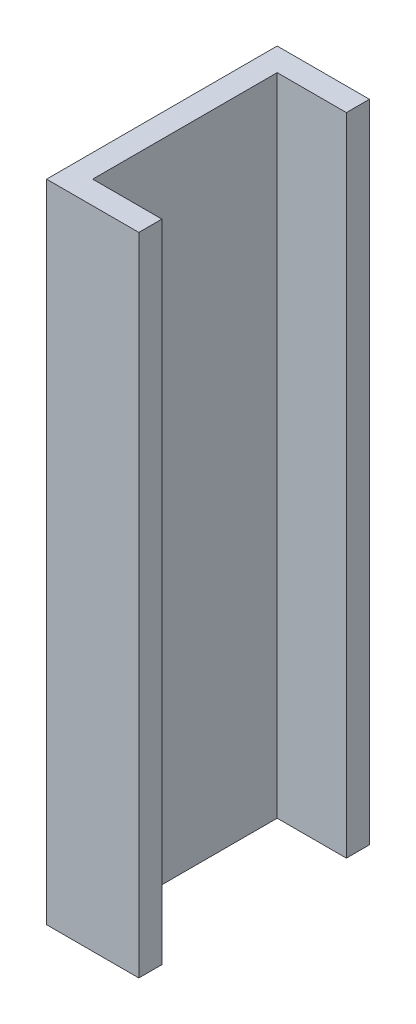
ISO-10303-21;
HEADER;
FILE_DESCRIPTION(('STEP AP214'),'2;1');
FILE_NAME('part.step','',(''),(''),'','','');
FILE_SCHEMA(('AUTOMOTIVE_DESIGN { 1 0 10303 214 1 1 1 1 }'));
ENDSEC;
DATA;
#1=APPLICATION_CONTEXT('core data for automotive mechanical design processes');
#2=APPLICATION_PROTOCOL_DEFINITION('international standard','automotive_design',2000,#1);
#3=PRODUCT_CONTEXT('',#1,'mechanical');
#4=PRODUCT('Part','Part','',(#3));
#5=PRODUCT_RELATED_PRODUCT_CATEGORY('part','',(#4));
#6=PRODUCT_DEFINITION_FORMATION('','',#4);
#7=PRODUCT_DEFINITION_CONTEXT('part definition',#1,'design');
#8=PRODUCT_DEFINITION('design','',#6,#7);
#9=PRODUCT_DEFINITION_SHAPE('','',#8);
#10=(LENGTH_UNIT() NAMED_UNIT(*) SI_UNIT(.MILLI.,.METRE.));
#11=(NAMED_UNIT(*) PLANE_ANGLE_UNIT() SI_UNIT($,.RADIAN.));
#12=(NAMED_UNIT(*) SI_UNIT($,.STERADIAN.) SOLID_ANGLE_UNIT());
#13=UNCERTAINTY_MEASURE_WITH_UNIT(LENGTH_MEASURE(1.E-05),#10,'distance_accuracy_value','');
#14=(GEOMETRIC_REPRESENTATION_CONTEXT(3) GLOBAL_UNCERTAINTY_ASSIGNED_CONTEXT((#13)) GLOBAL_UNIT_ASSIGNED_CONTEXT((#10,
#11,#12)) REPRESENTATION_CONTEXT('',''));
#15=CARTESIAN_POINT('',(0.,0.,0.));
#16=DIRECTION('',(0.,0.,1.));
#17=DIRECTION('',(1.,0.,0.));
#18=AXIS2_PLACEMENT_3D('',#15,#16,#17);
#19=CARTESIAN_POINT('',(0.2,0.,0.));
#20=DIRECTION('',(1.,0.,0.));
#21=DIRECTION('',(0.,1.,0.));
#22=AXIS2_PLACEMENT_3D('',#19,#20,#21);
#23=PLANE('',#22);
#24=DIRECTION('',(0.,0.,1.));
#25=VECTOR('',#24,1.);
#26=CARTESIAN_POINT('',(0.2,0.,0.));
#27=LINE('',#26,#25);
#28=CARTESIAN_POINT('',(0.2,0.,0.45));
#29=VERTEX_POINT('',#28);
#30=CARTESIAN_POINT('',(0.2,0.,0.5));
#31=VERTEX_POINT('',#30);
#32=EDGE_CURVE('E159',#29,#31,#27,.T.);
#33=ORIENTED_EDGE('',*,*,#32,.F.);
#34=DIRECTION('',(0.,-1.,0.));
#35=VECTOR('',#34,1.);
#36=CARTESIAN_POINT('',(0.2,0.,0.45));
#37=LINE('',#36,#35);
#38=CARTESIAN_POINT('',(0.2,1.4,0.45));
#39=VERTEX_POINT('',#38);
#40=EDGE_CURVE('E11',#39,#29,#37,.T.);
#41=ORIENTED_EDGE('',*,*,#40,.F.);
#42=DIRECTION('',(0.,0.,1.));
#43=VECTOR('',#42,1.);
#44=CARTESIAN_POINT('',(0.2,1.4,0.));
#45=LINE('',#44,#43);
#46=CARTESIAN_POINT('',(0.2,1.4,0.5));
#47=VERTEX_POINT('',#46);
#48=EDGE_CURVE('E158',#39,#47,#45,.T.);
#49=ORIENTED_EDGE('',*,*,#48,.T.);
#50=DIRECTION('',(0.,1.,0.));
#51=VECTOR('',#50,1.);
#52=CARTESIAN_POINT('',(0.2,0.,0.5));
#53=LINE('',#52,#51);
#54=EDGE_CURVE('E97',#31,#47,#53,.T.);
#55=ORIENTED_EDGE('',*,*,#54,.F.);
#56=EDGE_LOOP('',(#33,#41,#49,#55));
#57=FACE_BOUND('',#56,.T.);
#58=ADVANCED_FACE('F17',(#57),#23,.T.);
#59=CARTESIAN_POINT('',(0.05,0.,0.45));
#60=DIRECTION('',(0.,0.,1.));
#61=DIRECTION('',(1.,0.,0.));
#62=AXIS2_PLACEMENT_3D('',#59,#60,#61);
#63=PLANE('',#62);
#64=ORIENTED_EDGE('',*,*,#40,.T.);
#65=DIRECTION('',(1.,0.,0.));
#66=VECTOR('',#65,1.);
#67=CARTESIAN_POINT('',(0.05,0.,0.45));
#68=LINE('',#67,#66);
#69=CARTESIAN_POINT('',(0.05,0.,0.45));
#70=VERTEX_POINT('',#69);
#71=EDGE_CURVE('E140',#70,#29,#68,.T.);
#72=ORIENTED_EDGE('',*,*,#71,.F.);
#73=DIRECTION('',(0.,1.,0.));
#74=VECTOR('',#73,1.);
#75=CARTESIAN_POINT('',(0.05,0.,0.45));
#76=LINE('',#75,#74);
#77=CARTESIAN_POINT('',(0.05,1.4,0.45));
#78=VERTEX_POINT('',#77);
#79=EDGE_CURVE('E26',#70,#78,#76,.T.);
#80=ORIENTED_EDGE('',*,*,#79,.T.);
#81=DIRECTION('',(1.,0.,0.));
#82=VECTOR('',#81,1.);
#83=CARTESIAN_POINT('',(0.05,1.4,0.45));
#84=LINE('',#83,#82);
#85=EDGE_CURVE('E154',#78,#39,#84,.T.);
#86=ORIENTED_EDGE('',*,*,#85,.T.);
#87=EDGE_LOOP('',(#64,#72,#80,#86));
#88=FACE_BOUND('',#87,.T.);
#89=ADVANCED_FACE('F198',(#88),#63,.F.);
#90=CARTESIAN_POINT('',(0.05,0.,0.05));
#91=DIRECTION('',(1.,0.,0.));
#92=DIRECTION('',(0.,1.,0.));
#93=AXIS2_PLACEMENT_3D('',#90,#91,#92);
#94=PLANE('',#93);
#95=DIRECTION('',(0.,0.,1.));
#96=VECTOR('',#95,1.);
#97=CARTESIAN_POINT('',(0.05,0.,0.05));
#98=LINE('',#97,#96);
#99=CARTESIAN_POINT('',(0.05,0.,0.05));
#100=VERTEX_POINT('',#99);
#101=EDGE_CURVE('E134',#100,#70,#98,.T.);
#102=ORIENTED_EDGE('',*,*,#101,.F.);
#103=DIRECTION('',(0.,1.,0.));
#104=VECTOR('',#103,1.);
#105=CARTESIAN_POINT('',(0.05,0.,0.05));
#106=LINE('',#105,#104);
#107=CARTESIAN_POINT('',(0.05,1.4,0.05));
#108=VERTEX_POINT('',#107);
#109=EDGE_CURVE('E38',#100,#108,#106,.T.);
#110=ORIENTED_EDGE('',*,*,#109,.T.);
#111=DIRECTION('',(0.,0.,1.));
#112=VECTOR('',#111,1.);
#113=CARTESIAN_POINT('',(0.05,1.4,0.05));
#114=LINE('',#113,#112);
#115=EDGE_CURVE('E157',#108,#78,#114,.T.);
#116=ORIENTED_EDGE('',*,*,#115,.T.);
#117=ORIENTED_EDGE('',*,*,#79,.F.);
#118=EDGE_LOOP('',(#102,#110,#116,#117));
#119=FACE_BOUND('',#118,.T.);
#120=ADVANCED_FACE('F202',(#119),#94,.T.);
#121=CARTESIAN_POINT('',(0.05,0.,0.05));
#122=DIRECTION('',(0.,0.,1.));
#123=DIRECTION('',(1.,0.,0.));
#124=AXIS2_PLACEMENT_3D('',#121,#122,#123);
#125=PLANE('',#124);
#126=DIRECTION('',(1.,0.,0.));
#127=VECTOR('',#126,1.);
#128=CARTESIAN_POINT('',(0.05,1.4,0.05));
#129=LINE('',#128,#127);
#130=CARTESIAN_POINT('',(0.2,1.4,0.05));
#131=VERTEX_POINT('',#130);
#132=EDGE_CURVE('E189',#108,#131,#129,.T.);
#133=ORIENTED_EDGE('',*,*,#132,.F.);
#134=ORIENTED_EDGE('',*,*,#109,.F.);
#135=DIRECTION('',(1.,0.,0.));
#136=VECTOR('',#135,1.);
#137=CARTESIAN_POINT('',(0.05,0.,0.05));
#138=LINE('',#137,#136);
#139=CARTESIAN_POINT('',(0.2,0.,0.05));
#140=VERTEX_POINT('',#139);
#141=EDGE_CURVE('E127',#100,#140,#138,.T.);
#142=ORIENTED_EDGE('',*,*,#141,.T.);
#143=DIRECTION('',(0.,-1.,0.));
#144=VECTOR('',#143,1.);
#145=CARTESIAN_POINT('',(0.2,0.,0.05));
#146=LINE('',#145,#144);
#147=EDGE_CURVE('E68',#131,#140,#146,.T.);
#148=ORIENTED_EDGE('',*,*,#147,.F.);
#149=EDGE_LOOP('',(#133,#134,#142,#148));
#150=FACE_BOUND('',#149,.T.);
#151=ADVANCED_FACE('F132',(#150),#125,.T.);
#152=CARTESIAN_POINT('',(0.2,0.,0.));
#153=DIRECTION('',(1.,0.,0.));
#154=DIRECTION('',(0.,1.,0.));
#155=AXIS2_PLACEMENT_3D('',#152,#153,#154);
#156=PLANE('',#155);
#157=DIRECTION('',(0.,0.,1.));
#158=VECTOR('',#157,1.);
#159=CARTESIAN_POINT('',(0.2,0.,0.));
#160=LINE('',#159,#158);
#161=CARTESIAN_POINT('',(0.2,0.,0.));
#162=VERTEX_POINT('',#161);
#163=EDGE_CURVE('E117',#162,#140,#160,.T.);
#164=ORIENTED_EDGE('',*,*,#163,.F.);
#165=DIRECTION('',(0.,1.,0.));
#166=VECTOR('',#165,1.);
#167=CARTESIAN_POINT('',(0.2,0.,0.));
#168=LINE('',#167,#166);
#169=CARTESIAN_POINT('',(0.2,1.4,0.));
#170=VERTEX_POINT('',#169);
#171=EDGE_CURVE('E89',#162,#170,#168,.T.);
#172=ORIENTED_EDGE('',*,*,#171,.T.);
#173=DIRECTION('',(0.,0.,1.));
#174=VECTOR('',#173,1.);
#175=CARTESIAN_POINT('',(0.2,1.4,0.));
#176=LINE('',#175,#174);
#177=EDGE_CURVE('E120',#170,#131,#176,.T.);
#178=ORIENTED_EDGE('',*,*,#177,.T.);
#179=ORIENTED_EDGE('',*,*,#147,.T.);
#180=EDGE_LOOP('',(#164,#172,#178,#179));
#181=FACE_BOUND('',#180,.T.);
#182=ADVANCED_FACE('F116',(#181),#156,.T.);
#183=CARTESIAN_POINT('',(0.,0.,0.));
#184=DIRECTION('',(0.,0.,1.));
#185=DIRECTION('',(1.,0.,0.));
#186=AXIS2_PLACEMENT_3D('',#183,#184,#185);
#187=PLANE('',#186);
#188=DIRECTION('',(1.,0.,0.));
#189=VECTOR('',#188,1.);
#190=CARTESIAN_POINT('',(0.,1.4,0.));
#191=LINE('',#190,#189);
#192=CARTESIAN_POINT('',(0.,1.4,0.));
#193=VERTEX_POINT('',#192);
#194=EDGE_CURVE('E182',#193,#170,#191,.T.);
#195=ORIENTED_EDGE('',*,*,#194,.T.);
#196=ORIENTED_EDGE('',*,*,#171,.F.);
#197=DIRECTION('',(1.,0.,0.));
#198=VECTOR('',#197,1.);
#199=CARTESIAN_POINT('',(0.,0.,0.));
#200=LINE('',#199,#198);
#201=CARTESIAN_POINT('',(0.,0.,0.));
#202=VERTEX_POINT('',#201);
#203=EDGE_CURVE('E129',#202,#162,#200,.T.);
#204=ORIENTED_EDGE('',*,*,#203,.F.);
#205=DIRECTION('',(0.,1.,0.));
#206=VECTOR('',#205,1.);
#207=CARTESIAN_POINT('',(0.,0.,0.));
#208=LINE('',#207,#206);
#209=EDGE_CURVE('E144',#202,#193,#208,.T.);
#210=ORIENTED_EDGE('',*,*,#209,.T.);
#211=EDGE_LOOP('',(#195,#196,#204,#210));
#212=FACE_BOUND('',#211,.T.);
#213=ADVANCED_FACE('F219',(#212),#187,.F.);
#214=CARTESIAN_POINT('',(0.,1.4,0.));
#215=DIRECTION('',(0.,1.,0.));
#216=DIRECTION('',(1.,0.,0.));
#217=AXIS2_PLACEMENT_3D('',#214,#215,#216);
#218=PLANE('',#217);
#219=ORIENTED_EDGE('',*,*,#177,.F.);
#220=ORIENTED_EDGE('',*,*,#194,.F.);
#221=DIRECTION('',(0.,0.,1.));
#222=VECTOR('',#221,1.);
#223=CARTESIAN_POINT('',(0.,1.4,0.));
#224=LINE('',#223,#222);
#225=CARTESIAN_POINT('',(0.,1.4,0.5));
#226=VERTEX_POINT('',#225);
#227=EDGE_CURVE('E149',#193,#226,#224,.T.);
#228=ORIENTED_EDGE('',*,*,#227,.T.);
#229=DIRECTION('',(1.,0.,0.));
#230=VECTOR('',#229,1.);
#231=CARTESIAN_POINT('',(0.,1.4,0.5));
#232=LINE('',#231,#230);
#233=EDGE_CURVE('E176',#226,#47,#232,.T.);
#234=ORIENTED_EDGE('',*,*,#233,.T.);
#235=ORIENTED_EDGE('',*,*,#48,.F.);
#236=ORIENTED_EDGE('',*,*,#85,.F.);
#237=ORIENTED_EDGE('',*,*,#115,.F.);
#238=ORIENTED_EDGE('',*,*,#132,.T.);
#239=EDGE_LOOP('',(#219,#220,#228,#234,#235,#236,#237,#238));
#240=FACE_BOUND('',#239,.T.);
#241=ADVANCED_FACE('F204',(#240),#218,.T.);
#242=CARTESIAN_POINT('',(0.,0.,0.5));
#243=DIRECTION('',(0.,0.,1.));
#244=DIRECTION('',(1.,0.,0.));
#245=AXIS2_PLACEMENT_3D('',#242,#243,#244);
#246=PLANE('',#245);
#247=DIRECTION('',(0.,1.,0.));
#248=VECTOR('',#247,1.);
#249=CARTESIAN_POINT('',(0.,0.,0.5));
#250=LINE('',#249,#248);
#251=CARTESIAN_POINT('',(0.,0.,0.5));
#252=VERTEX_POINT('',#251);
#253=EDGE_CURVE('E147',#252,#226,#250,.T.);
#254=ORIENTED_EDGE('',*,*,#253,.F.);
#255=DIRECTION('',(1.,0.,0.));
#256=VECTOR('',#255,1.);
#257=CARTESIAN_POINT('',(0.,0.,0.5));
#258=LINE('',#257,#256);
#259=EDGE_CURVE('E163',#252,#31,#258,.T.);
#260=ORIENTED_EDGE('',*,*,#259,.T.);
#261=ORIENTED_EDGE('',*,*,#54,.T.);
#262=ORIENTED_EDGE('',*,*,#233,.F.);
#263=EDGE_LOOP('',(#254,#260,#261,#262));
#264=FACE_BOUND('',#263,.T.);
#265=ADVANCED_FACE('F247',(#264),#246,.T.);
#266=CARTESIAN_POINT('',(0.,0.,0.));
#267=DIRECTION('',(0.,1.,0.));
#268=DIRECTION('',(1.,0.,0.));
#269=AXIS2_PLACEMENT_3D('',#266,#267,#268);
#270=PLANE('',#269);
#271=ORIENTED_EDGE('',*,*,#141,.F.);
#272=ORIENTED_EDGE('',*,*,#101,.T.);
#273=ORIENTED_EDGE('',*,*,#71,.T.);
#274=ORIENTED_EDGE('',*,*,#32,.T.);
#275=ORIENTED_EDGE('',*,*,#259,.F.);
#276=DIRECTION('',(0.,0.,1.));
#277=VECTOR('',#276,1.);
#278=CARTESIAN_POINT('',(0.,0.,0.));
#279=LINE('',#278,#277);
#280=EDGE_CURVE('E135',#202,#252,#279,.T.);
#281=ORIENTED_EDGE('',*,*,#280,.F.);
#282=ORIENTED_EDGE('',*,*,#203,.T.);
#283=ORIENTED_EDGE('',*,*,#163,.T.);
#284=EDGE_LOOP('',(#271,#272,#273,#274,#275,#281,#282,#283));
#285=FACE_BOUND('',#284,.T.);
#286=ADVANCED_FACE('F125',(#285),#270,.F.);
#287=CARTESIAN_POINT('',(0.,0.,0.));
#288=DIRECTION('',(1.,0.,0.));
#289=DIRECTION('',(0.,1.,0.));
#290=AXIS2_PLACEMENT_3D('',#287,#288,#289);
#291=PLANE('',#290);
#292=ORIENTED_EDGE('',*,*,#253,.T.);
#293=ORIENTED_EDGE('',*,*,#227,.F.);
#294=ORIENTED_EDGE('',*,*,#209,.F.);
#295=ORIENTED_EDGE('',*,*,#280,.T.);
#296=EDGE_LOOP('',(#292,#293,#294,#295));
#297=FACE_BOUND('',#296,.T.);
#298=ADVANCED_FACE('F262',(#297),#291,.F.);
#299=CLOSED_SHELL('',(#58,#89,#120,#151,#182,#213,#241,#265,#286,#298));
#300=MANIFOLD_SOLID_BREP('B1',#299);
#301=ADVANCED_BREP_SHAPE_REPRESENTATION('',(#18,#300),#14);
#302=SHAPE_DEFINITION_REPRESENTATION(#9,#301);
ENDSEC;
END-ISO-10303-21;
